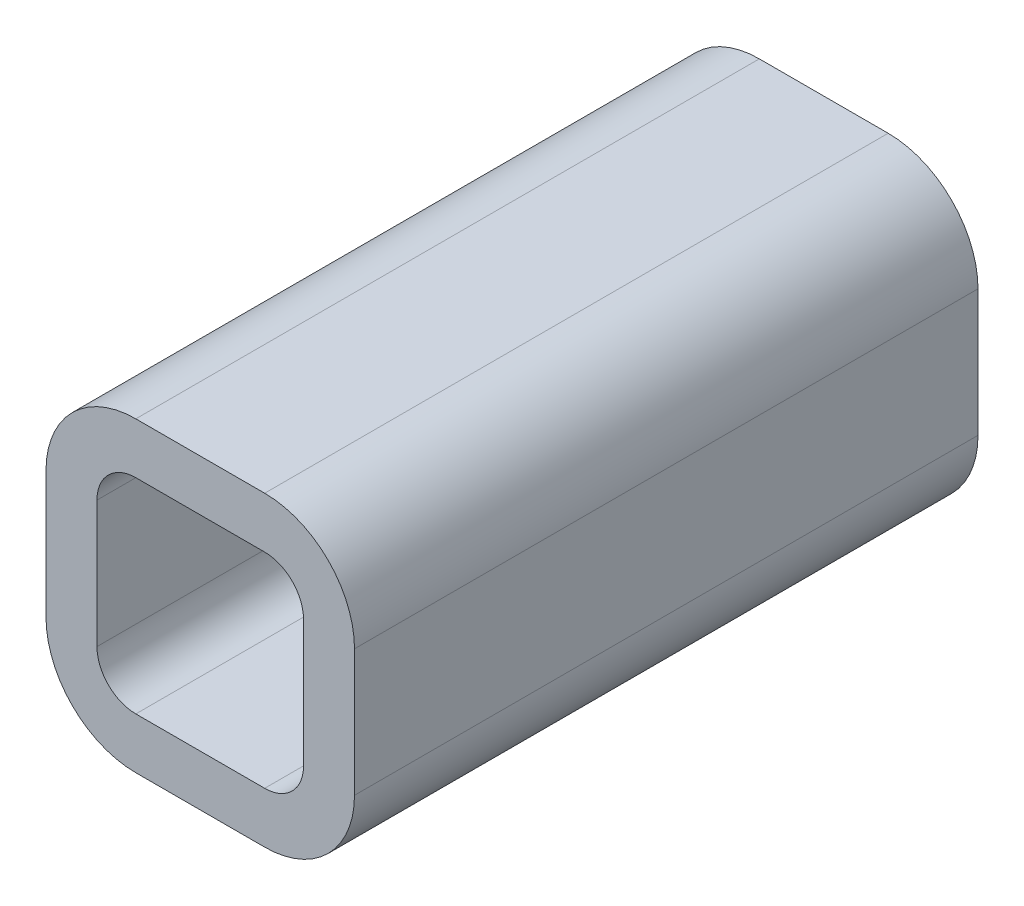
ISO-10303-21;
HEADER;
FILE_DESCRIPTION(('STEP AP214'),'2;1');
FILE_NAME('part.step','',(''),(''),'','','');
FILE_SCHEMA(('AUTOMOTIVE_DESIGN { 1 0 10303 214 1 1 1 1 }'));
ENDSEC;
DATA;
#1=APPLICATION_CONTEXT('core data for automotive mechanical design processes');
#2=APPLICATION_PROTOCOL_DEFINITION('international standard','automotive_design',2000,#1);
#3=PRODUCT_CONTEXT('',#1,'mechanical');
#4=PRODUCT('Part','Part','',(#3));
#5=PRODUCT_RELATED_PRODUCT_CATEGORY('part','',(#4));
#6=PRODUCT_DEFINITION_FORMATION('','',#4);
#7=PRODUCT_DEFINITION_CONTEXT('part definition',#1,'design');
#8=PRODUCT_DEFINITION('design','',#6,#7);
#9=PRODUCT_DEFINITION_SHAPE('','',#8);
#10=(LENGTH_UNIT() NAMED_UNIT(*) SI_UNIT(.MILLI.,.METRE.));
#11=(NAMED_UNIT(*) PLANE_ANGLE_UNIT() SI_UNIT($,.RADIAN.));
#12=(NAMED_UNIT(*) SI_UNIT($,.STERADIAN.) SOLID_ANGLE_UNIT());
#13=UNCERTAINTY_MEASURE_WITH_UNIT(LENGTH_MEASURE(1.E-05),#10,'distance_accuracy_value','');
#14=(GEOMETRIC_REPRESENTATION_CONTEXT(3) GLOBAL_UNCERTAINTY_ASSIGNED_CONTEXT((#13)) GLOBAL_UNIT_ASSIGNED_CONTEXT((#10,
#11,#12)) REPRESENTATION_CONTEXT('',''));
#15=CARTESIAN_POINT('',(0.,0.,0.));
#16=DIRECTION('',(0.,0.,1.));
#17=DIRECTION('',(1.,0.,0.));
#18=AXIS2_PLACEMENT_3D('',#15,#16,#17);
#19=CARTESIAN_POINT('',(5.41999999998258,3.51000000004454,34.5));
#20=DIRECTION('',(0.,0.,-1.));
#21=DIRECTION('',(-1.,0.,0.));
#22=AXIS2_PLACEMENT_3D('',#19,#20,#21);
#23=PLANE('',#22);
#24=CARTESIAN_POINT('',(5.41999464053169,3.5100000000448,34.5));
#25=DIRECTION('',(0.,0.,1.));
#26=DIRECTION('',(-1.,0.,0.));
#27=AXIS2_PLACEMENT_3D('',#24,#25,#26);
#28=CIRCLE('',#27,2.14999999999974);
#29=CARTESIAN_POINT('',(7.56999464046059,3.51001745284605,34.5));
#30=VERTEX_POINT('',#29);
#31=CARTESIAN_POINT('',(5.41999464053169,5.66000000004454,34.5));
#32=VERTEX_POINT('',#31);
#33=EDGE_CURVE('E308',#30,#32,#28,.T.);
#34=ORIENTED_EDGE('',*,*,#33,.F.);
#35=DIRECTION('',(-1.52692926362385E-06,0.999999999998834,0.));
#36=VECTOR('',#35,1.);
#37=CARTESIAN_POINT('',(7.57000535950402,-3.50998254714636,34.5));
#38=LINE('',#37,#36);
#39=CARTESIAN_POINT('',(7.57000535950402,-3.50998254714636,34.5));
#40=VERTEX_POINT('',#39);
#41=EDGE_CURVE('E312',#40,#30,#38,.T.);
#42=ORIENTED_EDGE('',*,*,#41,.F.);
#43=CARTESIAN_POINT('',(5.42000535950345,-3.50998583004403,34.5));
#44=DIRECTION('',(0.,0.,1.));
#45=DIRECTION('',(-1.,0.,0.));
#46=AXIS2_PLACEMENT_3D('',#43,#44,#45);
#47=CIRCLE('',#46,2.15000000000307);
#48=CARTESIAN_POINT('',(5.42000864240137,-5.6599858300446,34.5));
#49=VERTEX_POINT('',#48);
#50=EDGE_CURVE('E288',#49,#40,#47,.T.);
#51=ORIENTED_EDGE('',*,*,#50,.F.);
#52=DIRECTION('',(0.999999999998834,1.52692926383753E-06,0.));
#53=VECTOR('',#52,1.);
#54=CARTESIAN_POINT('',(-1.70999135759004,-5.65999671705025,34.5));
#55=LINE('',#54,#53);
#56=CARTESIAN_POINT('',(-1.70999135759004,-5.65999671705025,34.5));
#57=VERTEX_POINT('',#56);
#58=EDGE_CURVE('E65',#57,#49,#55,.T.);
#59=ORIENTED_EDGE('',*,*,#58,.F.);
#60=CARTESIAN_POINT('',(-1.70999464048769,-3.50999671705273,34.5));
#61=DIRECTION('',(0.,0.,1.));
#62=DIRECTION('',(-1.,0.,0.));
#63=AXIS2_PLACEMENT_3D('',#60,#61,#62);
#64=CIRCLE('',#63,2.15000000000003);
#65=CARTESIAN_POINT('',(-3.85999464048522,-3.50999999995065,34.5));
#66=VERTEX_POINT('',#65);
#67=EDGE_CURVE('E292',#66,#57,#64,.T.);
#68=ORIENTED_EDGE('',*,*,#67,.F.);
#69=DIRECTION('',(1.52692926362324E-06,-0.999999999998834,0.));
#70=VECTOR('',#69,1.);
#71=CARTESIAN_POINT('',(-3.86000535952865,3.51000000004455,34.5));
#72=LINE('',#71,#70);
#73=CARTESIAN_POINT('',(-3.86000535952865,3.51000000004455,34.5));
#74=VERTEX_POINT('',#73);
#75=EDGE_CURVE('E296',#74,#66,#72,.T.);
#76=ORIENTED_EDGE('',*,*,#75,.F.);
#77=CARTESIAN_POINT('',(-1.71000535952865,3.51000000004455,34.5));
#78=DIRECTION('',(0.,0.,1.));
#79=DIRECTION('',(-1.,0.,0.));
#80=AXIS2_PLACEMENT_3D('',#77,#78,#79);
#81=CIRCLE('',#80,2.14999999999999);
#82=CARTESIAN_POINT('',(-1.71000535952865,5.66000000004454,34.5));
#83=VERTEX_POINT('',#82);
#84=EDGE_CURVE('E300',#83,#74,#81,.T.);
#85=ORIENTED_EDGE('',*,*,#84,.F.);
#86=DIRECTION('',(-1.,0.,0.));
#87=VECTOR('',#86,1.);
#88=CARTESIAN_POINT('',(5.41999464053169,5.66000000004454,34.5));
#89=LINE('',#88,#87);
#90=EDGE_CURVE('E304',#32,#83,#89,.T.);
#91=ORIENTED_EDGE('',*,*,#90,.F.);
#92=EDGE_LOOP('',(#34,#42,#51,#59,#68,#76,#85,#91));
#93=FACE_BOUND('',#92,.T.);
#94=CARTESIAN_POINT('',(5.41999999998258,3.51000000004454,34.5));
#95=DIRECTION('',(0.,0.,1.));
#96=DIRECTION('',(-1.,0.,0.));
#97=AXIS2_PLACEMENT_3D('',#94,#95,#96);
#98=CIRCLE('',#97,4.97);
#99=CARTESIAN_POINT('',(10.3899999999826,3.51000000004454,34.5));
#100=VERTEX_POINT('',#99);
#101=CARTESIAN_POINT('',(5.41999999998254,8.48000000004454,34.5));
#102=VERTEX_POINT('',#101);
#103=EDGE_CURVE('E451',#100,#102,#98,.T.);
#104=ORIENTED_EDGE('',*,*,#103,.T.);
#105=DIRECTION('',(-1.,0.,0.));
#106=VECTOR('',#105,1.);
#107=CARTESIAN_POINT('',(-1.71000000000689,8.48000000004454,34.5));
#108=LINE('',#107,#106);
#109=CARTESIAN_POINT('',(-1.71000000000689,8.48000000004454,34.5));
#110=VERTEX_POINT('',#109);
#111=EDGE_CURVE('E455',#102,#110,#108,.T.);
#112=ORIENTED_EDGE('',*,*,#111,.T.);
#113=CARTESIAN_POINT('',(-1.71000000000693,3.51000000004454,34.5));
#114=DIRECTION('',(0.,0.,1.));
#115=DIRECTION('',(1.,0.,0.));
#116=AXIS2_PLACEMENT_3D('',#113,#114,#115);
#117=CIRCLE('',#116,4.97);
#118=CARTESIAN_POINT('',(-6.68000000000693,3.51000000004454,34.5));
#119=VERTEX_POINT('',#118);
#120=EDGE_CURVE('E459',#110,#119,#117,.T.);
#121=ORIENTED_EDGE('',*,*,#120,.T.);
#122=DIRECTION('',(0.,-1.,0.));
#123=VECTOR('',#122,1.);
#124=CARTESIAN_POINT('',(-6.68000000000693,3.51000000004454,34.5));
#125=LINE('',#124,#123);
#126=CARTESIAN_POINT('',(-6.68000000000693,-3.5100055929679,34.5));
#127=VERTEX_POINT('',#126);
#128=EDGE_CURVE('E462',#119,#127,#125,.T.);
#129=ORIENTED_EDGE('',*,*,#128,.T.);
#130=CARTESIAN_POINT('',(-1.71000000000693,-3.51000559296793,34.5));
#131=DIRECTION('',(0.,0.,1.));
#132=DIRECTION('',(1.,0.,0.));
#133=AXIS2_PLACEMENT_3D('',#130,#131,#132);
#134=CIRCLE('',#133,4.97);
#135=CARTESIAN_POINT('',(-1.71000000000693,-8.48000559296793,34.5));
#136=VERTEX_POINT('',#135);
#137=EDGE_CURVE('E465',#127,#136,#134,.T.);
#138=ORIENTED_EDGE('',*,*,#137,.T.);
#139=DIRECTION('',(1.,0.,0.));
#140=VECTOR('',#139,1.);
#141=CARTESIAN_POINT('',(-1.71000000000693,-8.48000559296793,34.5));
#142=LINE('',#141,#140);
#143=CARTESIAN_POINT('',(5.41999999998254,-8.48000559296793,34.5));
#144=VERTEX_POINT('',#143);
#145=EDGE_CURVE('E468',#136,#144,#142,.T.);
#146=ORIENTED_EDGE('',*,*,#145,.T.);
#147=CARTESIAN_POINT('',(5.41999999998258,-3.51000559296793,34.5));
#148=DIRECTION('',(0.,0.,1.));
#149=DIRECTION('',(1.,0.,0.));
#150=AXIS2_PLACEMENT_3D('',#147,#148,#149);
#151=CIRCLE('',#150,4.97);
#152=CARTESIAN_POINT('',(10.3899999999826,-3.51000559296793,34.5));
#153=VERTEX_POINT('',#152);
#154=EDGE_CURVE('E471',#144,#153,#151,.T.);
#155=ORIENTED_EDGE('',*,*,#154,.T.);
#156=DIRECTION('',(0.,1.,0.));
#157=VECTOR('',#156,1.);
#158=CARTESIAN_POINT('',(10.3899999999826,3.51000000004454,34.5));
#159=LINE('',#158,#157);
#160=EDGE_CURVE('E474',#153,#100,#159,.T.);
#161=ORIENTED_EDGE('',*,*,#160,.T.);
#162=EDGE_LOOP('',(#104,#112,#121,#129,#138,#146,#155,#161));
#163=FACE_BOUND('',#162,.T.);
#164=ADVANCED_FACE('F41',(#93,#163),#23,.F.);
#165=CARTESIAN_POINT('',(5.41999999998258,3.51000000004454,0.));
#166=DIRECTION('',(0.,0.,-1.));
#167=DIRECTION('',(-1.,0.,0.));
#168=AXIS2_PLACEMENT_3D('',#165,#166,#167);
#169=PLANE('',#168);
#170=CARTESIAN_POINT('',(5.41999999998258,3.51000000004454,0.));
#171=DIRECTION('',(0.,0.,1.));
#172=DIRECTION('',(-1.,0.,0.));
#173=AXIS2_PLACEMENT_3D('',#170,#171,#172);
#174=CIRCLE('',#173,4.97);
#175=CARTESIAN_POINT('',(10.3899999999826,3.51000000004454,0.));
#176=VERTEX_POINT('',#175);
#177=CARTESIAN_POINT('',(5.41999999998254,8.48000000004454,0.));
#178=VERTEX_POINT('',#177);
#179=EDGE_CURVE('E450',#176,#178,#174,.T.);
#180=ORIENTED_EDGE('',*,*,#179,.F.);
#181=DIRECTION('',(0.,1.,0.));
#182=VECTOR('',#181,1.);
#183=CARTESIAN_POINT('',(10.3899999999826,3.51000000004454,0.));
#184=LINE('',#183,#182);
#185=CARTESIAN_POINT('',(10.3899999999826,-3.51000559296793,0.));
#186=VERTEX_POINT('',#185);
#187=EDGE_CURVE('E456',#186,#176,#184,.T.);
#188=ORIENTED_EDGE('',*,*,#187,.F.);
#189=CARTESIAN_POINT('',(5.41999999998258,-3.51000559296793,0.));
#190=DIRECTION('',(0.,0.,1.));
#191=DIRECTION('',(1.,0.,0.));
#192=AXIS2_PLACEMENT_3D('',#189,#190,#191);
#193=CIRCLE('',#192,4.97);
#194=CARTESIAN_POINT('',(5.41999999998254,-8.48000559296793,0.));
#195=VERTEX_POINT('',#194);
#196=EDGE_CURVE('E496',#195,#186,#193,.T.);
#197=ORIENTED_EDGE('',*,*,#196,.F.);
#198=DIRECTION('',(1.,0.,0.));
#199=VECTOR('',#198,1.);
#200=CARTESIAN_POINT('',(-1.71000000000693,-8.48000559296793,0.));
#201=LINE('',#200,#199);
#202=CARTESIAN_POINT('',(-1.71000000000693,-8.48000559296793,0.));
#203=VERTEX_POINT('',#202);
#204=EDGE_CURVE('E493',#203,#195,#201,.T.);
#205=ORIENTED_EDGE('',*,*,#204,.F.);
#206=CARTESIAN_POINT('',(-1.71000000000693,-3.51000559296793,0.));
#207=DIRECTION('',(0.,0.,1.));
#208=DIRECTION('',(1.,0.,0.));
#209=AXIS2_PLACEMENT_3D('',#206,#207,#208);
#210=CIRCLE('',#209,4.97);
#211=CARTESIAN_POINT('',(-6.68000000000693,-3.5100055929679,0.));
#212=VERTEX_POINT('',#211);
#213=EDGE_CURVE('E490',#212,#203,#210,.T.);
#214=ORIENTED_EDGE('',*,*,#213,.F.);
#215=DIRECTION('',(0.,-1.,0.));
#216=VECTOR('',#215,1.);
#217=CARTESIAN_POINT('',(-6.68000000000693,3.51000000004454,0.));
#218=LINE('',#217,#216);
#219=CARTESIAN_POINT('',(-6.68000000000693,3.51000000004454,0.));
#220=VERTEX_POINT('',#219);
#221=EDGE_CURVE('E487',#220,#212,#218,.T.);
#222=ORIENTED_EDGE('',*,*,#221,.F.);
#223=CARTESIAN_POINT('',(-1.71000000000693,3.51000000004454,0.));
#224=DIRECTION('',(0.,0.,1.));
#225=DIRECTION('',(1.,0.,0.));
#226=AXIS2_PLACEMENT_3D('',#223,#224,#225);
#227=CIRCLE('',#226,4.97);
#228=CARTESIAN_POINT('',(-1.71000000000689,8.48000000004454,0.));
#229=VERTEX_POINT('',#228);
#230=EDGE_CURVE('E484',#229,#220,#227,.T.);
#231=ORIENTED_EDGE('',*,*,#230,.F.);
#232=DIRECTION('',(-1.,0.,0.));
#233=VECTOR('',#232,1.);
#234=CARTESIAN_POINT('',(-1.71000000000689,8.48000000004454,0.));
#235=LINE('',#234,#233);
#236=EDGE_CURVE('E481',#178,#229,#235,.T.);
#237=ORIENTED_EDGE('',*,*,#236,.F.);
#238=EDGE_LOOP('',(#180,#188,#197,#205,#214,#222,#231,#237));
#239=FACE_BOUND('',#238,.T.);
#240=CARTESIAN_POINT('',(0.,0.,0.));
#241=DIRECTION('',(0.,0.,1.));
#242=DIRECTION('',(1.,0.,0.));
#243=AXIS2_PLACEMENT_3D('',#240,#241,#242);
#244=CIRCLE('',#243,1.70000000000001);
#245=CARTESIAN_POINT('',(1.70000000000001,0.,0.));
#246=VERTEX_POINT('',#245);
#247=EDGE_CURVE('E446',#246,#246,#244,.T.);
#248=ORIENTED_EDGE('',*,*,#247,.T.);
#249=EDGE_LOOP('',(#248));
#250=FACE_BOUND('',#249,.T.);
#251=DIRECTION('',(-1.,0.,0.));
#252=VECTOR('',#251,1.);
#253=CARTESIAN_POINT('',(4.20840289767272,3.49999440705108,0.));
#254=LINE('',#253,#252);
#255=CARTESIAN_POINT('',(4.80840289767272,3.49999440705108,0.));
#256=VERTEX_POINT('',#255);
#257=CARTESIAN_POINT('',(4.20840289767272,3.49999440705108,0.));
#258=VERTEX_POINT('',#257);
#259=EDGE_CURVE('E418',#256,#258,#254,.T.);
#260=ORIENTED_EDGE('',*,*,#259,.T.);
#261=CARTESIAN_POINT('',(4.20840289767272,2.99999440705108,0.));
#262=DIRECTION('',(0.,0.,1.));
#263=DIRECTION('',(1.,0.,0.));
#264=AXIS2_PLACEMENT_3D('',#261,#262,#263);
#265=CIRCLE('',#264,0.5);
#266=CARTESIAN_POINT('',(3.70840289767272,2.99999440705108,0.));
#267=VERTEX_POINT('',#266);
#268=EDGE_CURVE('E390',#258,#267,#265,.T.);
#269=ORIENTED_EDGE('',*,*,#268,.T.);
#270=DIRECTION('',(0.,-1.,0.));
#271=VECTOR('',#270,1.);
#272=CARTESIAN_POINT('',(3.70840289767272,2.99999440705108,0.));
#273=LINE('',#272,#271);
#274=CARTESIAN_POINT('',(3.70840289767272,-2.99999440695718,0.));
#275=VERTEX_POINT('',#274);
#276=EDGE_CURVE('E394',#267,#275,#273,.T.);
#277=ORIENTED_EDGE('',*,*,#276,.T.);
#278=CARTESIAN_POINT('',(4.20840289767271,-2.99999440695718,0.));
#279=DIRECTION('',(0.,0.,1.));
#280=DIRECTION('',(1.,0.,0.));
#281=AXIS2_PLACEMENT_3D('',#278,#279,#280);
#282=CIRCLE('',#281,0.499999999999999);
#283=CARTESIAN_POINT('',(4.20840289767271,-3.49999440695718,0.));
#284=VERTEX_POINT('',#283);
#285=EDGE_CURVE('E398',#275,#284,#282,.T.);
#286=ORIENTED_EDGE('',*,*,#285,.T.);
#287=DIRECTION('',(1.,0.,0.));
#288=VECTOR('',#287,1.);
#289=CARTESIAN_POINT('',(4.20840289767271,-3.49999440695718,0.));
#290=LINE('',#289,#288);
#291=CARTESIAN_POINT('',(4.80840289767272,-3.49999440695718,0.));
#292=VERTEX_POINT('',#291);
#293=EDGE_CURVE('E402',#284,#292,#290,.T.);
#294=ORIENTED_EDGE('',*,*,#293,.T.);
#295=CARTESIAN_POINT('',(4.80840289767272,-2.99999440695718,0.));
#296=DIRECTION('',(0.,0.,1.));
#297=DIRECTION('',(1.,0.,0.));
#298=AXIS2_PLACEMENT_3D('',#295,#296,#297);
#299=CIRCLE('',#298,0.499999999999997);
#300=CARTESIAN_POINT('',(5.30840289767271,-2.99999440695718,0.));
#301=VERTEX_POINT('',#300);
#302=EDGE_CURVE('E406',#292,#301,#299,.T.);
#303=ORIENTED_EDGE('',*,*,#302,.T.);
#304=DIRECTION('',(0.,1.,0.));
#305=VECTOR('',#304,1.);
#306=CARTESIAN_POINT('',(5.30840289767271,2.99999440705108,0.));
#307=LINE('',#306,#305);
#308=CARTESIAN_POINT('',(5.30840289767271,2.99999440705108,0.));
#309=VERTEX_POINT('',#308);
#310=EDGE_CURVE('E410',#301,#309,#307,.T.);
#311=ORIENTED_EDGE('',*,*,#310,.T.);
#312=CARTESIAN_POINT('',(4.80840289767272,2.99999440705108,0.));
#313=DIRECTION('',(0.,0.,1.));
#314=DIRECTION('',(1.,0.,0.));
#315=AXIS2_PLACEMENT_3D('',#312,#313,#314);
#316=CIRCLE('',#315,0.5);
#317=EDGE_CURVE('E414',#309,#256,#316,.T.);
#318=ORIENTED_EDGE('',*,*,#317,.T.);
#319=EDGE_LOOP('',(#260,#269,#277,#286,#294,#303,#311,#318));
#320=FACE_BOUND('',#319,.T.);
#321=ADVANCED_FACE('F539',(#239,#250,#320),#169,.T.);
#322=CARTESIAN_POINT('',(5.41999999998258,3.51000000004454,34.5));
#323=DIRECTION('',(0.,0.,-1.));
#324=DIRECTION('',(-1.,0.,0.));
#325=AXIS2_PLACEMENT_3D('',#322,#323,#324);
#326=CYLINDRICAL_SURFACE('',#325,4.97);
#327=ORIENTED_EDGE('',*,*,#179,.T.);
#328=DIRECTION('',(0.,0.,-1.));
#329=VECTOR('',#328,1.);
#330=CARTESIAN_POINT('',(5.41999999998254,8.48000000004454,34.5));
#331=LINE('',#330,#329);
#332=EDGE_CURVE('E50',#102,#178,#331,.T.);
#333=ORIENTED_EDGE('',*,*,#332,.F.);
#334=ORIENTED_EDGE('',*,*,#103,.F.);
#335=DIRECTION('',(0.,0.,-1.));
#336=VECTOR('',#335,1.);
#337=CARTESIAN_POINT('',(10.3899999999826,3.51000000004454,34.5));
#338=LINE('',#337,#336);
#339=EDGE_CURVE('E477',#100,#176,#338,.T.);
#340=ORIENTED_EDGE('',*,*,#339,.T.);
#341=EDGE_LOOP('',(#327,#333,#334,#340));
#342=FACE_BOUND('',#341,.T.);
#343=ADVANCED_FACE('F43',(#342),#326,.T.);
#344=CARTESIAN_POINT('',(-1.71000000000689,8.48000000004454,34.5));
#345=DIRECTION('',(0.,-1.,0.));
#346=DIRECTION('',(0.,0.,-1.));
#347=AXIS2_PLACEMENT_3D('',#344,#345,#346);
#348=PLANE('',#347);
#349=ORIENTED_EDGE('',*,*,#236,.T.);
#350=DIRECTION('',(0.,0.,-1.));
#351=VECTOR('',#350,1.);
#352=CARTESIAN_POINT('',(-1.71000000000689,8.48000000004454,34.5));
#353=LINE('',#352,#351);
#354=EDGE_CURVE('E524',#110,#229,#353,.T.);
#355=ORIENTED_EDGE('',*,*,#354,.F.);
#356=ORIENTED_EDGE('',*,*,#111,.F.);
#357=ORIENTED_EDGE('',*,*,#332,.T.);
#358=EDGE_LOOP('',(#349,#355,#356,#357));
#359=FACE_BOUND('',#358,.T.);
#360=ADVANCED_FACE('F531',(#359),#348,.F.);
#361=CARTESIAN_POINT('',(-1.71000000000693,3.51000000004454,34.5));
#362=DIRECTION('',(0.,0.,-1.));
#363=DIRECTION('',(-1.,0.,0.));
#364=AXIS2_PLACEMENT_3D('',#361,#362,#363);
#365=CYLINDRICAL_SURFACE('',#364,4.97);
#366=ORIENTED_EDGE('',*,*,#230,.T.);
#367=DIRECTION('',(0.,0.,-1.));
#368=VECTOR('',#367,1.);
#369=CARTESIAN_POINT('',(-6.68000000000693,3.51000000004454,34.5));
#370=LINE('',#369,#368);
#371=EDGE_CURVE('E520',#119,#220,#370,.T.);
#372=ORIENTED_EDGE('',*,*,#371,.F.);
#373=ORIENTED_EDGE('',*,*,#120,.F.);
#374=ORIENTED_EDGE('',*,*,#354,.T.);
#375=EDGE_LOOP('',(#366,#372,#373,#374));
#376=FACE_BOUND('',#375,.T.);
#377=ADVANCED_FACE('F547',(#376),#365,.T.);
#378=CARTESIAN_POINT('',(-6.68000000000693,3.51000000004454,34.5));
#379=DIRECTION('',(1.,0.,0.));
#380=DIRECTION('',(0.,0.,-1.));
#381=AXIS2_PLACEMENT_3D('',#378,#379,#380);
#382=PLANE('',#381);
#383=ORIENTED_EDGE('',*,*,#221,.T.);
#384=DIRECTION('',(0.,0.,-1.));
#385=VECTOR('',#384,1.);
#386=CARTESIAN_POINT('',(-6.68000000000693,-3.5100055929679,34.5));
#387=LINE('',#386,#385);
#388=EDGE_CURVE('E516',#127,#212,#387,.T.);
#389=ORIENTED_EDGE('',*,*,#388,.F.);
#390=ORIENTED_EDGE('',*,*,#128,.F.);
#391=ORIENTED_EDGE('',*,*,#371,.T.);
#392=EDGE_LOOP('',(#383,#389,#390,#391));
#393=FACE_BOUND('',#392,.T.);
#394=ADVANCED_FACE('F551',(#393),#382,.F.);
#395=CARTESIAN_POINT('',(-1.71000000000693,-3.51000559296793,34.5));
#396=DIRECTION('',(0.,0.,-1.));
#397=DIRECTION('',(-1.,0.,0.));
#398=AXIS2_PLACEMENT_3D('',#395,#396,#397);
#399=CYLINDRICAL_SURFACE('',#398,4.97);
#400=ORIENTED_EDGE('',*,*,#213,.T.);
#401=DIRECTION('',(0.,0.,-1.));
#402=VECTOR('',#401,1.);
#403=CARTESIAN_POINT('',(-1.71000000000693,-8.48000559296793,34.5));
#404=LINE('',#403,#402);
#405=EDGE_CURVE('E512',#136,#203,#404,.T.);
#406=ORIENTED_EDGE('',*,*,#405,.F.);
#407=ORIENTED_EDGE('',*,*,#137,.F.);
#408=ORIENTED_EDGE('',*,*,#388,.T.);
#409=EDGE_LOOP('',(#400,#406,#407,#408));
#410=FACE_BOUND('',#409,.T.);
#411=ADVANCED_FACE('F569',(#410),#399,.T.);
#412=CARTESIAN_POINT('',(-1.71000000000693,-8.48000559296793,34.5));
#413=DIRECTION('',(0.,1.,0.));
#414=DIRECTION('',(0.,0.,1.));
#415=AXIS2_PLACEMENT_3D('',#412,#413,#414);
#416=PLANE('',#415);
#417=ORIENTED_EDGE('',*,*,#204,.T.);
#418=DIRECTION('',(0.,0.,-1.));
#419=VECTOR('',#418,1.);
#420=CARTESIAN_POINT('',(5.41999999998254,-8.48000559296793,34.5));
#421=LINE('',#420,#419);
#422=EDGE_CURVE('E508',#144,#195,#421,.T.);
#423=ORIENTED_EDGE('',*,*,#422,.F.);
#424=ORIENTED_EDGE('',*,*,#145,.F.);
#425=ORIENTED_EDGE('',*,*,#405,.T.);
#426=EDGE_LOOP('',(#417,#423,#424,#425));
#427=FACE_BOUND('',#426,.T.);
#428=ADVANCED_FACE('F566',(#427),#416,.F.);
#429=CARTESIAN_POINT('',(5.41999999998258,-3.51000559296793,34.5));
#430=DIRECTION('',(0.,0.,-1.));
#431=DIRECTION('',(-1.,0.,0.));
#432=AXIS2_PLACEMENT_3D('',#429,#430,#431);
#433=CYLINDRICAL_SURFACE('',#432,4.97);
#434=ORIENTED_EDGE('',*,*,#196,.T.);
#435=DIRECTION('',(0.,0.,-1.));
#436=VECTOR('',#435,1.);
#437=CARTESIAN_POINT('',(10.3899999999826,-3.51000559296793,34.5));
#438=LINE('',#437,#436);
#439=EDGE_CURVE('E504',#153,#186,#438,.T.);
#440=ORIENTED_EDGE('',*,*,#439,.F.);
#441=ORIENTED_EDGE('',*,*,#154,.F.);
#442=ORIENTED_EDGE('',*,*,#422,.T.);
#443=EDGE_LOOP('',(#434,#440,#441,#442));
#444=FACE_BOUND('',#443,.T.);
#445=ADVANCED_FACE('F562',(#444),#433,.T.);
#446=CARTESIAN_POINT('',(10.3899999999826,3.51000000004454,34.5));
#447=DIRECTION('',(-1.,0.,0.));
#448=DIRECTION('',(0.,0.,1.));
#449=AXIS2_PLACEMENT_3D('',#446,#447,#448);
#450=PLANE('',#449);
#451=ORIENTED_EDGE('',*,*,#187,.T.);
#452=ORIENTED_EDGE('',*,*,#339,.F.);
#453=ORIENTED_EDGE('',*,*,#160,.F.);
#454=ORIENTED_EDGE('',*,*,#439,.T.);
#455=EDGE_LOOP('',(#451,#452,#453,#454));
#456=FACE_BOUND('',#455,.T.);
#457=ADVANCED_FACE('F560',(#456),#450,.F.);
#458=CARTESIAN_POINT('',(0.,0.,34.5));
#459=DIRECTION('',(0.,0.,-1.));
#460=DIRECTION('',(-1.,0.,0.));
#461=AXIS2_PLACEMENT_3D('',#458,#459,#460);
#462=CYLINDRICAL_SURFACE('',#461,1.70000000000001);
#463=CARTESIAN_POINT('',(0.,0.,14.));
#464=DIRECTION('',(0.,0.,-1.));
#465=DIRECTION('',(-1.,0.,0.));
#466=AXIS2_PLACEMENT_3D('',#463,#464,#465);
#467=CIRCLE('',#466,1.70000000000001);
#468=CARTESIAN_POINT('',(-1.70000000000001,0.,14.));
#469=VERTEX_POINT('',#468);
#470=EDGE_CURVE('E386',#469,#469,#467,.T.);
#471=ORIENTED_EDGE('',*,*,#470,.F.);
#472=EDGE_LOOP('',(#471));
#473=FACE_BOUND('',#472,.T.);
#474=ORIENTED_EDGE('',*,*,#247,.F.);
#475=EDGE_LOOP('',(#474));
#476=FACE_BOUND('',#475,.T.);
#477=ADVANCED_FACE('F587',(#473,#476),#462,.F.);
#478=CARTESIAN_POINT('',(4.20840289767272,2.99999440705108,34.5));
#479=DIRECTION('',(0.,0.,-1.));
#480=DIRECTION('',(-1.,0.,0.));
#481=AXIS2_PLACEMENT_3D('',#478,#479,#480);
#482=CYLINDRICAL_SURFACE('',#481,0.5);
#483=ORIENTED_EDGE('',*,*,#268,.F.);
#484=DIRECTION('',(0.,0.,-1.));
#485=VECTOR('',#484,1.);
#486=CARTESIAN_POINT('',(4.20840289767272,3.49999440705108,34.5));
#487=LINE('',#486,#485);
#488=CARTESIAN_POINT('',(4.20840289767272,3.49999440705108,14.));
#489=VERTEX_POINT('',#488);
#490=EDGE_CURVE('E422',#489,#258,#487,.T.);
#491=ORIENTED_EDGE('',*,*,#490,.F.);
#492=CARTESIAN_POINT('',(4.20840289767272,2.99999440705108,14.));
#493=DIRECTION('',(0.,0.,-1.));
#494=DIRECTION('',(-1.,0.,0.));
#495=AXIS2_PLACEMENT_3D('',#492,#493,#494);
#496=CIRCLE('',#495,0.5);
#497=CARTESIAN_POINT('',(3.70840289767272,2.99999440705108,14.));
#498=VERTEX_POINT('',#497);
#499=EDGE_CURVE('E383',#498,#489,#496,.T.);
#500=ORIENTED_EDGE('',*,*,#499,.F.);
#501=DIRECTION('',(0.,0.,-1.));
#502=VECTOR('',#501,1.);
#503=CARTESIAN_POINT('',(3.70840289767272,2.99999440705108,34.5));
#504=LINE('',#503,#502);
#505=EDGE_CURVE('E443',#498,#267,#504,.T.);
#506=ORIENTED_EDGE('',*,*,#505,.T.);
#507=EDGE_LOOP('',(#483,#491,#500,#506));
#508=FACE_BOUND('',#507,.T.);
#509=ADVANCED_FACE('F607',(#508),#482,.F.);
#510=CARTESIAN_POINT('',(3.70840289767272,2.99999440705108,34.5));
#511=DIRECTION('',(1.,0.,0.));
#512=DIRECTION('',(0.,0.,-1.));
#513=AXIS2_PLACEMENT_3D('',#510,#511,#512);
#514=PLANE('',#513);
#515=ORIENTED_EDGE('',*,*,#276,.F.);
#516=ORIENTED_EDGE('',*,*,#505,.F.);
#517=DIRECTION('',(0.,1.,0.));
#518=VECTOR('',#517,1.);
#519=CARTESIAN_POINT('',(3.70840289767272,2.99999440705108,14.));
#520=LINE('',#519,#518);
#521=CARTESIAN_POINT('',(3.70840289767272,-2.99999440695718,14.));
#522=VERTEX_POINT('',#521);
#523=EDGE_CURVE('E380',#522,#498,#520,.T.);
#524=ORIENTED_EDGE('',*,*,#523,.F.);
#525=DIRECTION('',(0.,0.,-1.));
#526=VECTOR('',#525,1.);
#527=CARTESIAN_POINT('',(3.70840289767272,-2.99999440695718,34.5));
#528=LINE('',#527,#526);
#529=EDGE_CURVE('E440',#522,#275,#528,.T.);
#530=ORIENTED_EDGE('',*,*,#529,.T.);
#531=EDGE_LOOP('',(#515,#516,#524,#530));
#532=FACE_BOUND('',#531,.T.);
#533=ADVANCED_FACE('F615',(#532),#514,.T.);
#534=CARTESIAN_POINT('',(4.20840289767271,-2.99999440695718,34.5));
#535=DIRECTION('',(0.,0.,-1.));
#536=DIRECTION('',(-1.,0.,0.));
#537=AXIS2_PLACEMENT_3D('',#534,#535,#536);
#538=CYLINDRICAL_SURFACE('',#537,0.499999999999999);
#539=ORIENTED_EDGE('',*,*,#285,.F.);
#540=ORIENTED_EDGE('',*,*,#529,.F.);
#541=CARTESIAN_POINT('',(4.20840289767271,-2.99999440695718,14.));
#542=DIRECTION('',(0.,0.,-1.));
#543=DIRECTION('',(-1.,0.,0.));
#544=AXIS2_PLACEMENT_3D('',#541,#542,#543);
#545=CIRCLE('',#544,0.499999999999999);
#546=CARTESIAN_POINT('',(4.20840289767271,-3.49999440695718,14.));
#547=VERTEX_POINT('',#546);
#548=EDGE_CURVE('E377',#547,#522,#545,.T.);
#549=ORIENTED_EDGE('',*,*,#548,.F.);
#550=DIRECTION('',(0.,0.,-1.));
#551=VECTOR('',#550,1.);
#552=CARTESIAN_POINT('',(4.20840289767271,-3.49999440695718,34.5));
#553=LINE('',#552,#551);
#554=EDGE_CURVE('E437',#547,#284,#553,.T.);
#555=ORIENTED_EDGE('',*,*,#554,.T.);
#556=EDGE_LOOP('',(#539,#540,#549,#555));
#557=FACE_BOUND('',#556,.T.);
#558=ADVANCED_FACE('F623',(#557),#538,.F.);
#559=CARTESIAN_POINT('',(4.20840289767271,-3.49999440695718,34.5));
#560=DIRECTION('',(0.,1.,0.));
#561=DIRECTION('',(0.,0.,1.));
#562=AXIS2_PLACEMENT_3D('',#559,#560,#561);
#563=PLANE('',#562);
#564=ORIENTED_EDGE('',*,*,#293,.F.);
#565=ORIENTED_EDGE('',*,*,#554,.F.);
#566=DIRECTION('',(-1.,0.,0.));
#567=VECTOR('',#566,1.);
#568=CARTESIAN_POINT('',(4.20840289767271,-3.49999440695718,14.));
#569=LINE('',#568,#567);
#570=CARTESIAN_POINT('',(5.50840289767272,-3.49999440695718,14.));
#571=VERTEX_POINT('',#570);
#572=EDGE_CURVE('E374',#571,#547,#569,.T.);
#573=ORIENTED_EDGE('',*,*,#572,.F.);
#574=DIRECTION('',(0.,0.,1.));
#575=VECTOR('',#574,1.);
#576=CARTESIAN_POINT('',(5.50840289767272,-3.49999440695718,-7.36816418086899));
#577=LINE('',#576,#575);
#578=CARTESIAN_POINT('',(5.50840289767272,-3.49999440695718,7.));
#579=VERTEX_POINT('',#578);
#580=EDGE_CURVE('E242',#579,#571,#577,.T.);
#581=ORIENTED_EDGE('',*,*,#580,.F.);
#582=DIRECTION('',(1.,0.,0.));
#583=VECTOR('',#582,1.);
#584=CARTESIAN_POINT('',(5.50840289767272,-3.49999440695718,7.));
#585=LINE('',#584,#583);
#586=CARTESIAN_POINT('',(4.80840289767272,-3.49999440695718,7.));
#587=VERTEX_POINT('',#586);
#588=EDGE_CURVE('E255',#587,#579,#585,.T.);
#589=ORIENTED_EDGE('',*,*,#588,.F.);
#590=DIRECTION('',(0.,0.,-1.));
#591=VECTOR('',#590,1.);
#592=CARTESIAN_POINT('',(4.80840289767272,-3.49999440695718,34.5));
#593=LINE('',#592,#591);
#594=EDGE_CURVE('E434',#587,#292,#593,.T.);
#595=ORIENTED_EDGE('',*,*,#594,.T.);
#596=EDGE_LOOP('',(#564,#565,#573,#581,#589,#595));
#597=FACE_BOUND('',#596,.T.);
#598=ADVANCED_FACE('F631',(#597),#563,.T.);
#599=CARTESIAN_POINT('',(4.80840289767272,-2.99999440695718,34.5));
#600=DIRECTION('',(0.,0.,-1.));
#601=DIRECTION('',(-1.,0.,0.));
#602=AXIS2_PLACEMENT_3D('',#599,#600,#601);
#603=CYLINDRICAL_SURFACE('',#602,0.499999999999997);
#604=CARTESIAN_POINT('',(4.80840289767272,-2.99999440695718,7.));
#605=DIRECTION('',(0.,0.,-1.));
#606=DIRECTION('',(-1.,0.,0.));
#607=AXIS2_PLACEMENT_3D('',#604,#605,#606);
#608=CIRCLE('',#607,0.499999999999997);
#609=CARTESIAN_POINT('',(5.30840289767271,-2.99999440695718,7.));
#610=VERTEX_POINT('',#609);
#611=EDGE_CURVE('E285',#610,#587,#608,.T.);
#612=ORIENTED_EDGE('',*,*,#611,.F.);
#613=DIRECTION('',(0.,0.,-1.));
#614=VECTOR('',#613,1.);
#615=CARTESIAN_POINT('',(5.30840289767271,-2.99999440695718,34.5));
#616=LINE('',#615,#614);
#617=EDGE_CURVE('E431',#610,#301,#616,.T.);
#618=ORIENTED_EDGE('',*,*,#617,.T.);
#619=ORIENTED_EDGE('',*,*,#302,.F.);
#620=ORIENTED_EDGE('',*,*,#594,.F.);
#621=EDGE_LOOP('',(#612,#618,#619,#620));
#622=FACE_BOUND('',#621,.T.);
#623=ADVANCED_FACE('F639',(#622),#603,.F.);
#624=CARTESIAN_POINT('',(5.30840289767271,2.99999440705108,34.5));
#625=DIRECTION('',(-1.,0.,0.));
#626=DIRECTION('',(0.,0.,1.));
#627=AXIS2_PLACEMENT_3D('',#624,#625,#626);
#628=PLANE('',#627);
#629=DIRECTION('',(0.,-1.,0.));
#630=VECTOR('',#629,1.);
#631=CARTESIAN_POINT('',(5.30840289767271,2.99999440705108,7.));
#632=LINE('',#631,#630);
#633=CARTESIAN_POINT('',(5.30840289767272,2.99999440705108,7.));
#634=VERTEX_POINT('',#633);
#635=EDGE_CURVE('E282',#634,#610,#632,.T.);
#636=ORIENTED_EDGE('',*,*,#635,.F.);
#637=DIRECTION('',(0.,0.,-1.));
#638=VECTOR('',#637,1.);
#639=CARTESIAN_POINT('',(5.30840289767271,2.99999440705108,34.5));
#640=LINE('',#639,#638);
#641=EDGE_CURVE('E428',#634,#309,#640,.T.);
#642=ORIENTED_EDGE('',*,*,#641,.T.);
#643=ORIENTED_EDGE('',*,*,#310,.F.);
#644=ORIENTED_EDGE('',*,*,#617,.F.);
#645=EDGE_LOOP('',(#636,#642,#643,#644));
#646=FACE_BOUND('',#645,.T.);
#647=ADVANCED_FACE('F647',(#646),#628,.T.);
#648=CARTESIAN_POINT('',(4.80840289767272,2.99999440705108,34.5));
#649=DIRECTION('',(0.,0.,-1.));
#650=DIRECTION('',(-1.,0.,0.));
#651=AXIS2_PLACEMENT_3D('',#648,#649,#650);
#652=CYLINDRICAL_SURFACE('',#651,0.5);
#653=CARTESIAN_POINT('',(4.80840289767272,2.99999440705108,7.));
#654=DIRECTION('',(0.,0.,-1.));
#655=DIRECTION('',(-1.,0.,0.));
#656=AXIS2_PLACEMENT_3D('',#653,#654,#655);
#657=CIRCLE('',#656,0.5);
#658=CARTESIAN_POINT('',(4.80840289767272,3.49999440705108,7.));
#659=VERTEX_POINT('',#658);
#660=EDGE_CURVE('E279',#659,#634,#657,.T.);
#661=ORIENTED_EDGE('',*,*,#660,.F.);
#662=DIRECTION('',(0.,0.,-1.));
#663=VECTOR('',#662,1.);
#664=CARTESIAN_POINT('',(4.80840289767272,3.49999440705108,34.5));
#665=LINE('',#664,#663);
#666=EDGE_CURVE('E425',#659,#256,#665,.T.);
#667=ORIENTED_EDGE('',*,*,#666,.T.);
#668=ORIENTED_EDGE('',*,*,#317,.F.);
#669=ORIENTED_EDGE('',*,*,#641,.F.);
#670=EDGE_LOOP('',(#661,#667,#668,#669));
#671=FACE_BOUND('',#670,.T.);
#672=ADVANCED_FACE('F655',(#671),#652,.F.);
#673=CARTESIAN_POINT('',(4.20840289767272,3.49999440705108,34.5));
#674=DIRECTION('',(0.,-1.,0.));
#675=DIRECTION('',(0.,0.,-1.));
#676=AXIS2_PLACEMENT_3D('',#673,#674,#675);
#677=PLANE('',#676);
#678=ORIENTED_EDGE('',*,*,#666,.F.);
#679=DIRECTION('',(-1.,0.,0.));
#680=VECTOR('',#679,1.);
#681=CARTESIAN_POINT('',(5.50840289767272,3.49999440705108,7.));
#682=LINE('',#681,#680);
#683=CARTESIAN_POINT('',(5.50840289767272,3.49999440705108,7.));
#684=VERTEX_POINT('',#683);
#685=EDGE_CURVE('E252',#684,#659,#682,.T.);
#686=ORIENTED_EDGE('',*,*,#685,.F.);
#687=DIRECTION('',(0.,0.,1.));
#688=VECTOR('',#687,1.);
#689=CARTESIAN_POINT('',(5.50840289767272,3.49999440705108,-7.36816418086899));
#690=LINE('',#689,#688);
#691=CARTESIAN_POINT('',(5.50840289767272,3.49999440705108,14.));
#692=VERTEX_POINT('',#691);
#693=EDGE_CURVE('E264',#684,#692,#690,.T.);
#694=ORIENTED_EDGE('',*,*,#693,.T.);
#695=DIRECTION('',(1.,0.,0.));
#696=VECTOR('',#695,1.);
#697=CARTESIAN_POINT('',(4.20840289767272,3.49999440705108,14.));
#698=LINE('',#697,#696);
#699=EDGE_CURVE('E12',#489,#692,#698,.T.);
#700=ORIENTED_EDGE('',*,*,#699,.F.);
#701=ORIENTED_EDGE('',*,*,#490,.T.);
#702=ORIENTED_EDGE('',*,*,#259,.F.);
#703=EDGE_LOOP('',(#678,#686,#694,#700,#701,#702));
#704=FACE_BOUND('',#703,.T.);
#705=ADVANCED_FACE('F663',(#704),#677,.T.);
#706=CARTESIAN_POINT('',(5.41999999998258,3.51000000004454,14.));
#707=DIRECTION('',(0.,0.,-1.));
#708=DIRECTION('',(-1.,0.,0.));
#709=AXIS2_PLACEMENT_3D('',#706,#707,#708);
#710=PLANE('',#709);
#711=ORIENTED_EDGE('',*,*,#699,.T.);
#712=CARTESIAN_POINT('',(5.50840289767272,2.99999440705108,14.));
#713=DIRECTION('',(0.,0.,1.));
#714=DIRECTION('',(-1.,0.,0.));
#715=AXIS2_PLACEMENT_3D('',#712,#713,#714);
#716=CIRCLE('',#715,0.500000000000001);
#717=CARTESIAN_POINT('',(6.00840289767272,2.99999440705108,14.));
#718=VERTEX_POINT('',#717);
#719=EDGE_CURVE('E245',#718,#692,#716,.T.);
#720=ORIENTED_EDGE('',*,*,#719,.F.);
#721=DIRECTION('',(0.,1.,0.));
#722=VECTOR('',#721,1.);
#723=CARTESIAN_POINT('',(6.00840289767272,2.99999440705108,14.));
#724=LINE('',#723,#722);
#725=CARTESIAN_POINT('',(6.00840289767272,-2.99999440695718,14.));
#726=VERTEX_POINT('',#725);
#727=EDGE_CURVE('E57',#726,#718,#724,.T.);
#728=ORIENTED_EDGE('',*,*,#727,.F.);
#729=CARTESIAN_POINT('',(5.50840289767272,-2.99999440695718,14.));
#730=DIRECTION('',(0.,0.,1.));
#731=DIRECTION('',(-1.,0.,0.));
#732=AXIS2_PLACEMENT_3D('',#729,#730,#731);
#733=CIRCLE('',#732,0.499999999999999);
#734=EDGE_CURVE('E239',#571,#726,#733,.T.);
#735=ORIENTED_EDGE('',*,*,#734,.F.);
#736=ORIENTED_EDGE('',*,*,#572,.T.);
#737=ORIENTED_EDGE('',*,*,#548,.T.);
#738=ORIENTED_EDGE('',*,*,#523,.T.);
#739=ORIENTED_EDGE('',*,*,#499,.T.);
#740=EDGE_LOOP('',(#711,#720,#728,#735,#736,#737,#738,#739));
#741=FACE_BOUND('',#740,.T.);
#742=ORIENTED_EDGE('',*,*,#470,.T.);
#743=EDGE_LOOP('',(#742));
#744=FACE_BOUND('',#743,.T.);
#745=CARTESIAN_POINT('',(5.42000535950345,-3.50998583004403,14.));
#746=DIRECTION('',(0.,0.,-1.));
#747=DIRECTION('',(-1.,0.,0.));
#748=AXIS2_PLACEMENT_3D('',#745,#746,#747);
#749=CIRCLE('',#748,2.15000000000307);
#750=CARTESIAN_POINT('',(5.42000864240137,-5.6599858300446,14.));
#751=VERTEX_POINT('',#750);
#752=CARTESIAN_POINT('',(7.57000535950402,-3.50998254714636,14.));
#753=VERTEX_POINT('',#752);
#754=EDGE_CURVE('E323',#751,#753,#749,.F.);
#755=ORIENTED_EDGE('',*,*,#754,.T.);
#756=DIRECTION('',(-1.52692926362385E-06,0.999999999998834,0.));
#757=VECTOR('',#756,1.);
#758=CARTESIAN_POINT('',(7.57000535950402,-3.50998254714636,14.));
#759=LINE('',#758,#757);
#760=CARTESIAN_POINT('',(7.56999464046059,3.51001745284605,14.));
#761=VERTEX_POINT('',#760);
#762=EDGE_CURVE('E291',#753,#761,#759,.T.);
#763=ORIENTED_EDGE('',*,*,#762,.T.);
#764=CARTESIAN_POINT('',(5.41999464053169,3.5100000000448,14.));
#765=DIRECTION('',(0.,0.,-1.));
#766=DIRECTION('',(-1.,0.,0.));
#767=AXIS2_PLACEMENT_3D('',#764,#765,#766);
#768=CIRCLE('',#767,2.14999999999974);
#769=CARTESIAN_POINT('',(5.41999464053169,5.66000000004454,14.));
#770=VERTEX_POINT('',#769);
#771=EDGE_CURVE('E354',#761,#770,#768,.F.);
#772=ORIENTED_EDGE('',*,*,#771,.T.);
#773=DIRECTION('',(-1.,0.,0.));
#774=VECTOR('',#773,1.);
#775=CARTESIAN_POINT('',(5.41999464053169,5.66000000004454,14.));
#776=LINE('',#775,#774);
#777=CARTESIAN_POINT('',(-1.71000535952865,5.66000000004454,14.));
#778=VERTEX_POINT('',#777);
#779=EDGE_CURVE('E349',#770,#778,#776,.T.);
#780=ORIENTED_EDGE('',*,*,#779,.T.);
#781=CARTESIAN_POINT('',(-1.71000535952865,3.51000000004455,14.));
#782=DIRECTION('',(0.,0.,-1.));
#783=DIRECTION('',(-1.,0.,0.));
#784=AXIS2_PLACEMENT_3D('',#781,#782,#783);
#785=CIRCLE('',#784,2.14999999999999);
#786=CARTESIAN_POINT('',(-3.86000535952865,3.51000000004455,14.));
#787=VERTEX_POINT('',#786);
#788=EDGE_CURVE('E344',#778,#787,#785,.F.);
#789=ORIENTED_EDGE('',*,*,#788,.T.);
#790=DIRECTION('',(1.52692926362324E-06,-0.999999999998834,0.));
#791=VECTOR('',#790,1.);
#792=CARTESIAN_POINT('',(-3.86000535952865,3.51000000004455,14.));
#793=LINE('',#792,#791);
#794=CARTESIAN_POINT('',(-3.85999464048522,-3.50999999995065,14.));
#795=VERTEX_POINT('',#794);
#796=EDGE_CURVE('E339',#787,#795,#793,.T.);
#797=ORIENTED_EDGE('',*,*,#796,.T.);
#798=CARTESIAN_POINT('',(-1.70999464048769,-3.50999671705273,14.));
#799=DIRECTION('',(0.,0.,-1.));
#800=DIRECTION('',(-1.,0.,0.));
#801=AXIS2_PLACEMENT_3D('',#798,#799,#800);
#802=CIRCLE('',#801,2.15000000000003);
#803=CARTESIAN_POINT('',(-1.70999135759004,-5.65999671705025,14.));
#804=VERTEX_POINT('',#803);
#805=EDGE_CURVE('E334',#795,#804,#802,.F.);
#806=ORIENTED_EDGE('',*,*,#805,.T.);
#807=DIRECTION('',(0.999999999998834,1.52692926383753E-06,0.));
#808=VECTOR('',#807,1.);
#809=CARTESIAN_POINT('',(-1.70999135759004,-5.65999671705025,14.));
#810=LINE('',#809,#808);
#811=EDGE_CURVE('E329',#804,#751,#810,.T.);
#812=ORIENTED_EDGE('',*,*,#811,.T.);
#813=EDGE_LOOP('',(#755,#763,#772,#780,#789,#797,#806,#812));
#814=FACE_BOUND('',#813,.T.);
#815=ADVANCED_FACE('F248',(#741,#744,#814),#710,.F.);
#816=CARTESIAN_POINT('',(7.57000535950402,-3.50998254714636,-16.0868726206293));
#817=DIRECTION('',(0.999999999998834,1.52692926362385E-06,0.));
#818=DIRECTION('',(-1.52692926362385E-06,0.999999999998834,0.));
#819=AXIS2_PLACEMENT_3D('',#816,#817,#818);
#820=PLANE('',#819);
#821=DIRECTION('',(0.,0.,1.));
#822=VECTOR('',#821,1.);
#823=CARTESIAN_POINT('',(7.57000535950402,-3.50998254714636,-16.0868726206293));
#824=LINE('',#823,#822);
#825=EDGE_CURVE('E327',#753,#40,#824,.T.);
#826=ORIENTED_EDGE('',*,*,#825,.T.);
#827=ORIENTED_EDGE('',*,*,#41,.T.);
#828=DIRECTION('',(0.,0.,1.));
#829=VECTOR('',#828,1.);
#830=CARTESIAN_POINT('',(7.56999464046059,3.51001745284605,-16.0868726206293));
#831=LINE('',#830,#829);
#832=EDGE_CURVE('E322',#761,#30,#831,.T.);
#833=ORIENTED_EDGE('',*,*,#832,.F.);
#834=ORIENTED_EDGE('',*,*,#762,.F.);
#835=EDGE_LOOP('',(#826,#827,#833,#834));
#836=FACE_BOUND('',#835,.T.);
#837=ADVANCED_FACE('F678',(#836),#820,.F.);
#838=CARTESIAN_POINT('',(5.41999464053169,3.5100000000448,-16.0868726206293));
#839=DIRECTION('',(0.,0.,1.));
#840=DIRECTION('',(1.,0.,0.));
#841=AXIS2_PLACEMENT_3D('',#838,#839,#840);
#842=CYLINDRICAL_SURFACE('',#841,2.14999999999974);
#843=ORIENTED_EDGE('',*,*,#832,.T.);
#844=ORIENTED_EDGE('',*,*,#33,.T.);
#845=DIRECTION('',(0.,0.,1.));
#846=VECTOR('',#845,1.);
#847=CARTESIAN_POINT('',(5.41999464053169,5.66000000004454,-16.0868726206293));
#848=LINE('',#847,#846);
#849=EDGE_CURVE('E353',#770,#32,#848,.T.);
#850=ORIENTED_EDGE('',*,*,#849,.F.);
#851=ORIENTED_EDGE('',*,*,#771,.F.);
#852=EDGE_LOOP('',(#843,#844,#850,#851));
#853=FACE_BOUND('',#852,.T.);
#854=ADVANCED_FACE('F685',(#853),#842,.F.);
#855=CARTESIAN_POINT('',(5.41999464053169,5.66000000004454,-16.0868726206293));
#856=DIRECTION('',(0.,1.,0.));
#857=DIRECTION('',(0.,0.,1.));
#858=AXIS2_PLACEMENT_3D('',#855,#856,#857);
#859=PLANE('',#858);
#860=ORIENTED_EDGE('',*,*,#849,.T.);
#861=ORIENTED_EDGE('',*,*,#90,.T.);
#862=DIRECTION('',(0.,0.,1.));
#863=VECTOR('',#862,1.);
#864=CARTESIAN_POINT('',(-1.71000535952865,5.66000000004454,-16.0868726206293));
#865=LINE('',#864,#863);
#866=EDGE_CURVE('E348',#778,#83,#865,.T.);
#867=ORIENTED_EDGE('',*,*,#866,.F.);
#868=ORIENTED_EDGE('',*,*,#779,.F.);
#869=EDGE_LOOP('',(#860,#861,#867,#868));
#870=FACE_BOUND('',#869,.T.);
#871=ADVANCED_FACE('F693',(#870),#859,.F.);
#872=CARTESIAN_POINT('',(-1.71000535952865,3.51000000004455,-16.0868726206293));
#873=DIRECTION('',(0.,0.,1.));
#874=DIRECTION('',(1.,0.,0.));
#875=AXIS2_PLACEMENT_3D('',#872,#873,#874);
#876=CYLINDRICAL_SURFACE('',#875,2.14999999999999);
#877=ORIENTED_EDGE('',*,*,#866,.T.);
#878=ORIENTED_EDGE('',*,*,#84,.T.);
#879=DIRECTION('',(0.,0.,1.));
#880=VECTOR('',#879,1.);
#881=CARTESIAN_POINT('',(-3.86000535952865,3.51000000004455,-16.0868726206293));
#882=LINE('',#881,#880);
#883=EDGE_CURVE('E343',#787,#74,#882,.T.);
#884=ORIENTED_EDGE('',*,*,#883,.F.);
#885=ORIENTED_EDGE('',*,*,#788,.F.);
#886=EDGE_LOOP('',(#877,#878,#884,#885));
#887=FACE_BOUND('',#886,.T.);
#888=ADVANCED_FACE('F701',(#887),#876,.F.);
#889=CARTESIAN_POINT('',(-3.86000535952865,3.51000000004455,-16.0868726206293));
#890=DIRECTION('',(-0.999999999998834,-1.52692926362324E-06,0.));
#891=DIRECTION('',(1.52692926362324E-06,-0.999999999998834,0.));
#892=AXIS2_PLACEMENT_3D('',#889,#890,#891);
#893=PLANE('',#892);
#894=ORIENTED_EDGE('',*,*,#883,.T.);
#895=ORIENTED_EDGE('',*,*,#75,.T.);
#896=DIRECTION('',(0.,0.,1.));
#897=VECTOR('',#896,1.);
#898=CARTESIAN_POINT('',(-3.85999464048522,-3.50999999995065,-16.0868726206293));
#899=LINE('',#898,#897);
#900=EDGE_CURVE('E338',#795,#66,#899,.T.);
#901=ORIENTED_EDGE('',*,*,#900,.F.);
#902=ORIENTED_EDGE('',*,*,#796,.F.);
#903=EDGE_LOOP('',(#894,#895,#901,#902));
#904=FACE_BOUND('',#903,.T.);
#905=ADVANCED_FACE('F709',(#904),#893,.F.);
#906=CARTESIAN_POINT('',(-1.70999464048769,-3.50999671705273,-16.0868726206293));
#907=DIRECTION('',(0.,0.,1.));
#908=DIRECTION('',(1.,0.,0.));
#909=AXIS2_PLACEMENT_3D('',#906,#907,#908);
#910=CYLINDRICAL_SURFACE('',#909,2.15000000000003);
#911=ORIENTED_EDGE('',*,*,#900,.T.);
#912=ORIENTED_EDGE('',*,*,#67,.T.);
#913=DIRECTION('',(0.,0.,1.));
#914=VECTOR('',#913,1.);
#915=CARTESIAN_POINT('',(-1.70999135759004,-5.65999671705025,-16.0868726206293));
#916=LINE('',#915,#914);
#917=EDGE_CURVE('E333',#804,#57,#916,.T.);
#918=ORIENTED_EDGE('',*,*,#917,.F.);
#919=ORIENTED_EDGE('',*,*,#805,.F.);
#920=EDGE_LOOP('',(#911,#912,#918,#919));
#921=FACE_BOUND('',#920,.T.);
#922=ADVANCED_FACE('F717',(#921),#910,.F.);
#923=CARTESIAN_POINT('',(-1.70999135759004,-5.65999671705025,-16.0868726206293));
#924=DIRECTION('',(1.52692926383753E-06,-0.999999999998834,0.));
#925=DIRECTION('',(0.999999999998834,1.52692926383753E-06,0.));
#926=AXIS2_PLACEMENT_3D('',#923,#924,#925);
#927=PLANE('',#926);
#928=ORIENTED_EDGE('',*,*,#917,.T.);
#929=ORIENTED_EDGE('',*,*,#58,.T.);
#930=DIRECTION('',(0.,0.,1.));
#931=VECTOR('',#930,1.);
#932=CARTESIAN_POINT('',(5.42000864240137,-5.6599858300446,-16.0868726206293));
#933=LINE('',#932,#931);
#934=EDGE_CURVE('E328',#751,#49,#933,.T.);
#935=ORIENTED_EDGE('',*,*,#934,.F.);
#936=ORIENTED_EDGE('',*,*,#811,.F.);
#937=EDGE_LOOP('',(#928,#929,#935,#936));
#938=FACE_BOUND('',#937,.T.);
#939=ADVANCED_FACE('F725',(#938),#927,.F.);
#940=CARTESIAN_POINT('',(5.42000535950345,-3.50998583004403,-16.0868726206293));
#941=DIRECTION('',(0.,0.,1.));
#942=DIRECTION('',(1.,0.,0.));
#943=AXIS2_PLACEMENT_3D('',#940,#941,#942);
#944=CYLINDRICAL_SURFACE('',#943,2.15000000000307);
#945=ORIENTED_EDGE('',*,*,#934,.T.);
#946=ORIENTED_EDGE('',*,*,#50,.T.);
#947=ORIENTED_EDGE('',*,*,#825,.F.);
#948=ORIENTED_EDGE('',*,*,#754,.F.);
#949=EDGE_LOOP('',(#945,#946,#947,#948));
#950=FACE_BOUND('',#949,.T.);
#951=ADVANCED_FACE('F733',(#950),#944,.F.);
#952=CARTESIAN_POINT('',(5.41999999998258,3.51000000004454,7.));
#953=DIRECTION('',(0.,0.,-1.));
#954=DIRECTION('',(-1.,0.,0.));
#955=AXIS2_PLACEMENT_3D('',#952,#953,#954);
#956=PLANE('',#955);
#957=ORIENTED_EDGE('',*,*,#611,.T.);
#958=ORIENTED_EDGE('',*,*,#588,.T.);
#959=CARTESIAN_POINT('',(5.50840289767272,-2.99999440695718,7.));
#960=DIRECTION('',(0.,0.,-1.));
#961=DIRECTION('',(-1.,0.,0.));
#962=AXIS2_PLACEMENT_3D('',#959,#960,#961);
#963=CIRCLE('',#962,0.499999999999999);
#964=CARTESIAN_POINT('',(6.00840289767272,-2.99999440695718,7.));
#965=VERTEX_POINT('',#964);
#966=EDGE_CURVE('E235',#579,#965,#963,.F.);
#967=ORIENTED_EDGE('',*,*,#966,.T.);
#968=DIRECTION('',(0.,1.,0.));
#969=VECTOR('',#968,1.);
#970=CARTESIAN_POINT('',(6.00840289767272,2.99999440705108,7.));
#971=LINE('',#970,#969);
#972=CARTESIAN_POINT('',(6.00840289767272,2.99999440705108,7.));
#973=VERTEX_POINT('',#972);
#974=EDGE_CURVE('E230',#965,#973,#971,.T.);
#975=ORIENTED_EDGE('',*,*,#974,.T.);
#976=CARTESIAN_POINT('',(5.50840289767272,2.99999440705108,7.));
#977=DIRECTION('',(0.,0.,-1.));
#978=DIRECTION('',(-1.,0.,0.));
#979=AXIS2_PLACEMENT_3D('',#976,#977,#978);
#980=CIRCLE('',#979,0.500000000000001);
#981=EDGE_CURVE('E260',#973,#684,#980,.F.);
#982=ORIENTED_EDGE('',*,*,#981,.T.);
#983=ORIENTED_EDGE('',*,*,#685,.T.);
#984=ORIENTED_EDGE('',*,*,#660,.T.);
#985=ORIENTED_EDGE('',*,*,#635,.T.);
#986=EDGE_LOOP('',(#957,#958,#967,#975,#982,#983,#984,#985));
#987=FACE_BOUND('',#986,.T.);
#988=ADVANCED_FACE('F739',(#987),#956,.F.);
#989=CARTESIAN_POINT('',(5.50840289767272,-2.99999440695718,-7.36816418086899));
#990=DIRECTION('',(0.,0.,1.));
#991=DIRECTION('',(1.,0.,0.));
#992=AXIS2_PLACEMENT_3D('',#989,#990,#991);
#993=CYLINDRICAL_SURFACE('',#992,0.499999999999999);
#994=ORIENTED_EDGE('',*,*,#580,.T.);
#995=ORIENTED_EDGE('',*,*,#734,.T.);
#996=DIRECTION('',(0.,0.,1.));
#997=VECTOR('',#996,1.);
#998=CARTESIAN_POINT('',(6.00840289767272,-2.99999440695718,-7.36816418086899));
#999=LINE('',#998,#997);
#1000=EDGE_CURVE('E226',#965,#726,#999,.T.);
#1001=ORIENTED_EDGE('',*,*,#1000,.F.);
#1002=ORIENTED_EDGE('',*,*,#966,.F.);
#1003=EDGE_LOOP('',(#994,#995,#1001,#1002));
#1004=FACE_BOUND('',#1003,.T.);
#1005=ADVANCED_FACE('F240',(#1004),#993,.F.);
#1006=CARTESIAN_POINT('',(6.00840289767272,2.99999440705108,-7.36816418086899));
#1007=DIRECTION('',(1.,0.,0.));
#1008=DIRECTION('',(0.,0.,-1.));
#1009=AXIS2_PLACEMENT_3D('',#1006,#1007,#1008);
#1010=PLANE('',#1009);
#1011=ORIENTED_EDGE('',*,*,#1000,.T.);
#1012=ORIENTED_EDGE('',*,*,#727,.T.);
#1013=DIRECTION('',(0.,0.,1.));
#1014=VECTOR('',#1013,1.);
#1015=CARTESIAN_POINT('',(6.00840289767272,2.99999440705108,-7.36816418086899));
#1016=LINE('',#1015,#1014);
#1017=EDGE_CURVE('E265',#973,#718,#1016,.T.);
#1018=ORIENTED_EDGE('',*,*,#1017,.F.);
#1019=ORIENTED_EDGE('',*,*,#974,.F.);
#1020=EDGE_LOOP('',(#1011,#1012,#1018,#1019));
#1021=FACE_BOUND('',#1020,.T.);
#1022=ADVANCED_FACE('F228',(#1021),#1010,.F.);
#1023=CARTESIAN_POINT('',(5.50840289767272,2.99999440705108,-7.36816418086899));
#1024=DIRECTION('',(0.,0.,1.));
#1025=DIRECTION('',(1.,0.,0.));
#1026=AXIS2_PLACEMENT_3D('',#1023,#1024,#1025);
#1027=CYLINDRICAL_SURFACE('',#1026,0.500000000000001);
#1028=ORIENTED_EDGE('',*,*,#1017,.T.);
#1029=ORIENTED_EDGE('',*,*,#719,.T.);
#1030=ORIENTED_EDGE('',*,*,#693,.F.);
#1031=ORIENTED_EDGE('',*,*,#981,.F.);
#1032=EDGE_LOOP('',(#1028,#1029,#1030,#1031));
#1033=FACE_BOUND('',#1032,.T.);
#1034=ADVANCED_FACE('F759',(#1033),#1027,.F.);
#1035=CLOSED_SHELL('',(#164,#321,#343,#360,#377,#394,#411,#428,#445,#457,#477,#509,#533,#558,
#598,#623,#647,#672,#705,#815,#837,#854,#871,#888,#905,#922,#939,#951,#988,#1005,#1022,#1034));
#1036=MANIFOLD_SOLID_BREP('B2',#1035);
#1037=ADVANCED_BREP_SHAPE_REPRESENTATION('',(#18,#1036),#14);
#1038=SHAPE_DEFINITION_REPRESENTATION(#9,#1037);
ENDSEC;
END-ISO-10303-21;
